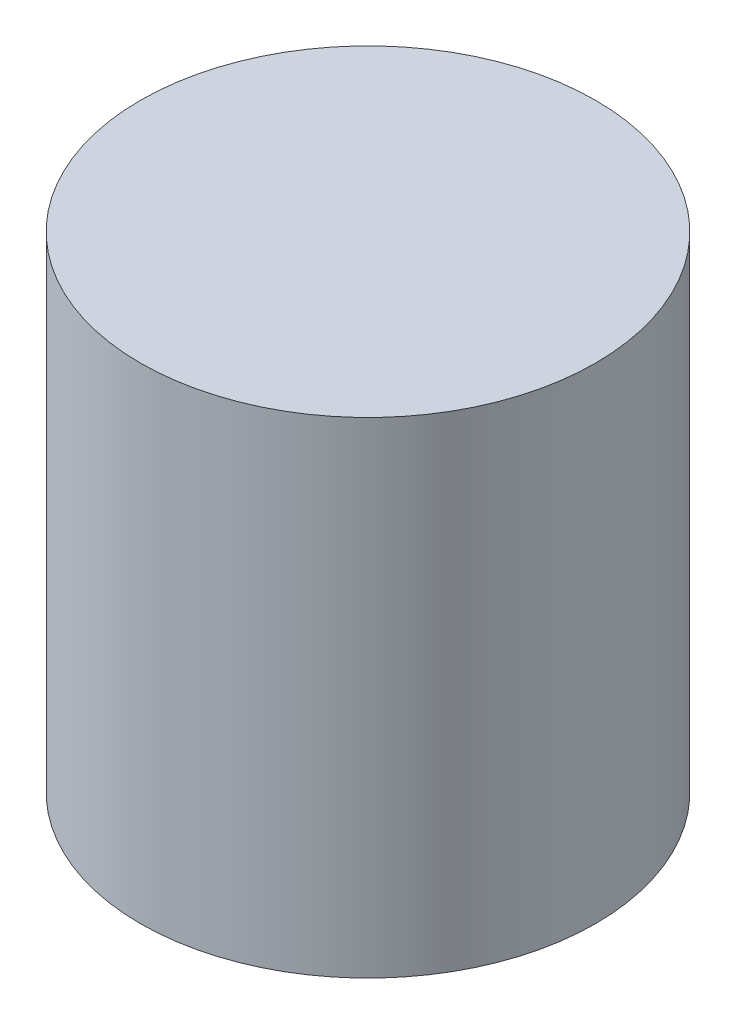
ISO-10303-21;
HEADER;
FILE_DESCRIPTION(('STEP AP214'),'2;1');
FILE_NAME('part.step','',(''),(''),'','','');
FILE_SCHEMA(('AUTOMOTIVE_DESIGN { 1 0 10303 214 1 1 1 1 }'));
ENDSEC;
DATA;
#1=APPLICATION_CONTEXT('core data for automotive mechanical design processes');
#2=APPLICATION_PROTOCOL_DEFINITION('international standard','automotive_design',2000,#1);
#3=PRODUCT_CONTEXT('',#1,'mechanical');
#4=PRODUCT('Part','Part','',(#3));
#5=PRODUCT_RELATED_PRODUCT_CATEGORY('part','',(#4));
#6=PRODUCT_DEFINITION_FORMATION('','',#4);
#7=PRODUCT_DEFINITION_CONTEXT('part definition',#1,'design');
#8=PRODUCT_DEFINITION('design','',#6,#7);
#9=PRODUCT_DEFINITION_SHAPE('','',#8);
#10=(LENGTH_UNIT() NAMED_UNIT(*) SI_UNIT(.MILLI.,.METRE.));
#11=(NAMED_UNIT(*) PLANE_ANGLE_UNIT() SI_UNIT($,.RADIAN.));
#12=(NAMED_UNIT(*) SI_UNIT($,.STERADIAN.) SOLID_ANGLE_UNIT());
#13=UNCERTAINTY_MEASURE_WITH_UNIT(LENGTH_MEASURE(1.E-05),#10,'distance_accuracy_value','');
#14=(GEOMETRIC_REPRESENTATION_CONTEXT(3) GLOBAL_UNCERTAINTY_ASSIGNED_CONTEXT((#13)) GLOBAL_UNIT_ASSIGNED_CONTEXT((#10,
#11,#12)) REPRESENTATION_CONTEXT('',''));
#15=CARTESIAN_POINT('',(0.,0.,0.));
#16=DIRECTION('',(0.,0.,1.));
#17=DIRECTION('',(1.,0.,0.));
#18=AXIS2_PLACEMENT_3D('',#15,#16,#17);
#19=CARTESIAN_POINT('',(0.,80.,0.));
#20=DIRECTION('',(0.,-1.,0.));
#21=DIRECTION('',(0.,0.,-1.));
#22=AXIS2_PLACEMENT_3D('',#19,#20,#21);
#23=CYLINDRICAL_SURFACE('',#22,37.5);
#24=CARTESIAN_POINT('',(0.,80.,0.));
#25=DIRECTION('',(0.,1.,0.));
#26=DIRECTION('',(0.,0.,1.));
#27=AXIS2_PLACEMENT_3D('',#24,#25,#26);
#28=CIRCLE('',#27,37.5);
#29=CARTESIAN_POINT('',(0.,80.,37.5));
#30=VERTEX_POINT('',#29);
#31=EDGE_CURVE('E10',#30,#30,#28,.T.);
#32=ORIENTED_EDGE('',*,*,#31,.F.);
#33=EDGE_LOOP('',(#32));
#34=FACE_BOUND('',#33,.T.);
#35=CARTESIAN_POINT('',(0.,0.,0.));
#36=DIRECTION('',(0.,1.,0.));
#37=DIRECTION('',(0.,0.,1.));
#38=AXIS2_PLACEMENT_3D('',#35,#36,#37);
#39=CIRCLE('',#38,37.5);
#40=CARTESIAN_POINT('',(0.,0.,37.5));
#41=VERTEX_POINT('',#40);
#42=EDGE_CURVE('E38',#41,#41,#39,.T.);
#43=ORIENTED_EDGE('',*,*,#42,.T.);
#44=EDGE_LOOP('',(#43));
#45=FACE_BOUND('',#44,.T.);
#46=ADVANCED_FACE('F35',(#34,#45),#23,.T.);
#47=CARTESIAN_POINT('',(0.,80.,0.));
#48=DIRECTION('',(0.,1.,0.));
#49=DIRECTION('',(0.,0.,1.));
#50=AXIS2_PLACEMENT_3D('',#47,#48,#49);
#51=PLANE('',#50);
#52=ORIENTED_EDGE('',*,*,#31,.T.);
#53=EDGE_LOOP('',(#52));
#54=FACE_BOUND('',#53,.T.);
#55=ADVANCED_FACE('F64',(#54),#51,.T.);
#56=CARTESIAN_POINT('',(0.,0.,0.));
#57=DIRECTION('',(0.,1.,0.));
#58=DIRECTION('',(0.,0.,1.));
#59=AXIS2_PLACEMENT_3D('',#56,#57,#58);
#60=PLANE('',#59);
#61=CARTESIAN_POINT('',(0.,0.,0.));
#62=DIRECTION('',(0.,-1.,0.));
#63=DIRECTION('',(0.,0.,-1.));
#64=AXIS2_PLACEMENT_3D('',#61,#62,#63);
#65=CIRCLE('',#64,4.);
#66=CARTESIAN_POINT('',(0.,0.,-4.));
#67=VERTEX_POINT('',#66);
#68=EDGE_CURVE('E47',#67,#67,#65,.T.);
#69=ORIENTED_EDGE('',*,*,#68,.F.);
#70=EDGE_LOOP('',(#69));
#71=FACE_BOUND('',#70,.T.);
#72=ORIENTED_EDGE('',*,*,#42,.F.);
#73=EDGE_LOOP('',(#72));
#74=FACE_BOUND('',#73,.T.);
#75=ADVANCED_FACE('F58',(#71,#74),#60,.F.);
#76=CARTESIAN_POINT('',(0.,13.7,0.));
#77=DIRECTION('',(0.,-1.,0.));
#78=DIRECTION('',(0.,0.,-1.));
#79=AXIS2_PLACEMENT_3D('',#76,#77,#78);
#80=CYLINDRICAL_SURFACE('',#79,4.);
#81=CARTESIAN_POINT('',(0.,13.7,0.));
#82=DIRECTION('',(0.,-1.,0.));
#83=DIRECTION('',(0.,0.,-1.));
#84=AXIS2_PLACEMENT_3D('',#81,#82,#83);
#85=CIRCLE('',#84,4.);
#86=CARTESIAN_POINT('',(0.,13.7,-4.));
#87=VERTEX_POINT('',#86);
#88=EDGE_CURVE('E45',#87,#87,#85,.T.);
#89=CARTESIAN_POINT('',(0.,13.7,-4.));
#90=CARTESIAN_POINT('',(0.,13.5572916666667,-4.));
#91=CARTESIAN_POINT('',(0.,13.4145833333333,-4.));
#92=CARTESIAN_POINT('',(0.,13.1291666666667,-4.));
#93=CARTESIAN_POINT('',(0.,12.9864583333333,-4.));
#94=CARTESIAN_POINT('',(0.,12.7010416666667,-4.));
#95=CARTESIAN_POINT('',(0.,12.5583333333333,-4.));
#96=CARTESIAN_POINT('',(0.,12.2729166666667,-4.));
#97=CARTESIAN_POINT('',(0.,12.1302083333333,-4.));
#98=CARTESIAN_POINT('',(0.,11.8447916666667,-4.));
#99=CARTESIAN_POINT('',(0.,11.7020833333333,-4.));
#100=CARTESIAN_POINT('',(0.,11.4166666666667,-4.));
#101=CARTESIAN_POINT('',(0.,11.2739583333333,-4.));
#102=CARTESIAN_POINT('',(0.,10.9885416666667,-4.));
#103=CARTESIAN_POINT('',(0.,10.8458333333333,-4.));
#104=CARTESIAN_POINT('',(0.,10.5604166666667,-4.));
#105=CARTESIAN_POINT('',(0.,10.4177083333333,-4.));
#106=CARTESIAN_POINT('',(0.,10.1322916666667,-4.));
#107=CARTESIAN_POINT('',(0.,9.98958333333333,-4.));
#108=CARTESIAN_POINT('',(0.,9.70416666666667,-4.));
#109=CARTESIAN_POINT('',(0.,9.56145833333333,-4.));
#110=CARTESIAN_POINT('',(0.,9.27604166666667,-4.));
#111=CARTESIAN_POINT('',(0.,9.13333333333333,-4.));
#112=CARTESIAN_POINT('',(0.,8.84791666666666,-4.));
#113=CARTESIAN_POINT('',(0.,8.70520833333333,-4.));
#114=CARTESIAN_POINT('',(0.,8.41979166666667,-4.));
#115=CARTESIAN_POINT('',(0.,8.27708333333333,-4.));
#116=CARTESIAN_POINT('',(0.,7.99166666666667,-4.));
#117=CARTESIAN_POINT('',(0.,7.84895833333333,-4.));
#118=CARTESIAN_POINT('',(0.,7.56354166666667,-4.));
#119=CARTESIAN_POINT('',(0.,7.42083333333333,-4.));
#120=CARTESIAN_POINT('',(0.,7.13541666666667,-4.));
#121=CARTESIAN_POINT('',(0.,6.99270833333333,-4.));
#122=CARTESIAN_POINT('',(0.,6.70729166666667,-4.));
#123=CARTESIAN_POINT('',(0.,6.56458333333333,-4.));
#124=CARTESIAN_POINT('',(0.,6.27916666666667,-4.));
#125=CARTESIAN_POINT('',(0.,6.13645833333333,-4.));
#126=CARTESIAN_POINT('',(0.,5.85104166666667,-4.));
#127=CARTESIAN_POINT('',(0.,5.70833333333333,-4.));
#128=CARTESIAN_POINT('',(0.,5.42291666666667,-4.));
#129=CARTESIAN_POINT('',(0.,5.28020833333333,-4.));
#130=CARTESIAN_POINT('',(0.,4.99479166666667,-4.));
#131=CARTESIAN_POINT('',(0.,4.85208333333333,-4.));
#132=CARTESIAN_POINT('',(0.,4.56666666666667,-4.));
#133=CARTESIAN_POINT('',(0.,4.42395833333333,-4.));
#134=CARTESIAN_POINT('',(0.,4.13854166666667,-4.));
#135=CARTESIAN_POINT('',(0.,3.99583333333333,-4.));
#136=CARTESIAN_POINT('',(0.,3.71041666666667,-4.));
#137=CARTESIAN_POINT('',(0.,3.56770833333333,-4.));
#138=CARTESIAN_POINT('',(0.,3.28229166666667,-4.));
#139=CARTESIAN_POINT('',(0.,3.13958333333333,-4.));
#140=CARTESIAN_POINT('',(0.,2.85416666666667,-4.));
#141=CARTESIAN_POINT('',(0.,2.71145833333333,-4.));
#142=CARTESIAN_POINT('',(0.,2.42604166666667,-4.));
#143=CARTESIAN_POINT('',(0.,2.28333333333333,-4.));
#144=CARTESIAN_POINT('',(0.,1.99791666666667,-4.));
#145=CARTESIAN_POINT('',(0.,1.85520833333333,-4.));
#146=CARTESIAN_POINT('',(0.,1.56979166666667,-4.));
#147=CARTESIAN_POINT('',(0.,1.42708333333333,-4.));
#148=CARTESIAN_POINT('',(0.,1.14166666666667,-4.));
#149=CARTESIAN_POINT('',(0.,0.998958333333333,-4.));
#150=CARTESIAN_POINT('',(0.,0.713541666666666,-4.));
#151=CARTESIAN_POINT('',(0.,0.570833333333333,-4.));
#152=CARTESIAN_POINT('',(0.,0.285416666666666,-4.));
#153=CARTESIAN_POINT('',(0.,0.142708333333333,-4.));
#154=CARTESIAN_POINT('',(0.,0.,-4.));
#155=B_SPLINE_CURVE_WITH_KNOTS('',3,(#89,#90,#91,#92,#93,#94,#95,#96,#97,#98,#99,#100,#101,#102,
#103,#104,#105,#106,#107,#108,#109,#110,#111,#112,#113,#114,#115,#116,#117,#118,#119,#120,#121,
#122,#123,#124,#125,#126,#127,#128,#129,#130,#131,#132,#133,#134,#135,#136,#137,#138,#139,#140,
#141,#142,#143,#144,#145,#146,#147,#148,#149,#150,#151,#152,#153,#154),.UNSPECIFIED.,.F.,.F.,(4,
2,2,2,2,2,2,2,2,2,2,2,2,2,2,2,2,2,2,2,2,2,2,2,2,2,2,2,2,2,2,2,4),(0.,0.428125000000001,
0.856250000000001,1.284375,1.7125,2.140625,2.56875,2.996875,3.425,3.853125,4.28125,4.709375,
5.1375,5.565625,5.99375,6.421875,6.85,7.278125,7.70625,8.134375,8.5625,8.990625,9.41875,
9.846875,10.275,10.703125,11.13125,11.559375,11.9875,12.415625,12.84375,13.271875,13.7),.UNSPECIFIED.);
#156=EDGE_CURVE('BSEAM55',#87,#67,#155,.T.);
#157=ORIENTED_EDGE('',*,*,#88,.F.);
#158=ORIENTED_EDGE('',*,*,#68,.T.);
#159=ORIENTED_EDGE('',*,*,#156,.T.);
#160=ORIENTED_EDGE('',*,*,#156,.F.);
#161=EDGE_LOOP('',(#157,#159,#158,#160));
#162=FACE_BOUND('',#161,.T.);
#163=ADVANCED_FACE('F55',(#162),#80,.F.);
#164=CARTESIAN_POINT('',(0.,13.7,0.));
#165=DIRECTION('',(0.,-1.,0.));
#166=DIRECTION('',(0.,0.,-1.));
#167=AXIS2_PLACEMENT_3D('',#164,#165,#166);
#168=PLANE('',#167);
#169=ORIENTED_EDGE('',*,*,#88,.T.);
#170=EDGE_LOOP('',(#169));
#171=FACE_BOUND('',#170,.T.);
#172=ADVANCED_FACE('F53',(#171),#168,.T.);
#173=CLOSED_SHELL('',(#46,#55,#75,#163,#172));
#174=MANIFOLD_SOLID_BREP('B2',#173);
#175=ADVANCED_BREP_SHAPE_REPRESENTATION('',(#18,#174),#14);
#176=SHAPE_DEFINITION_REPRESENTATION(#9,#175);
ENDSEC;
END-ISO-10303-21;
